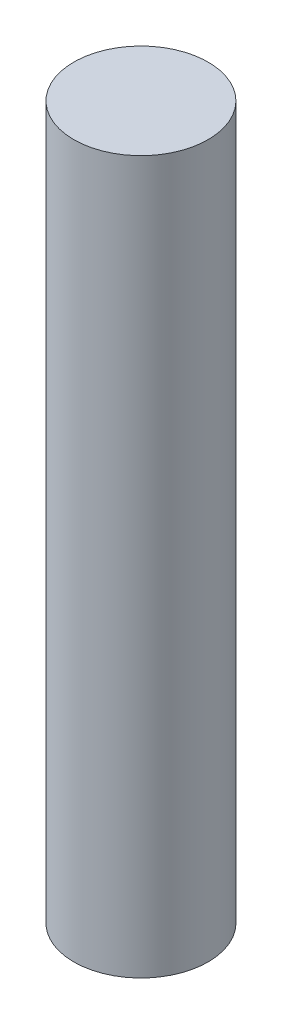
ISO-10303-21;
HEADER;
FILE_DESCRIPTION(('STEP AP214'),'2;1');
FILE_NAME('part.step','',(''),(''),'','','');
FILE_SCHEMA(('AUTOMOTIVE_DESIGN { 1 0 10303 214 1 1 1 1 }'));
ENDSEC;
DATA;
#1=APPLICATION_CONTEXT('core data for automotive mechanical design processes');
#2=APPLICATION_PROTOCOL_DEFINITION('international standard','automotive_design',2000,#1);
#3=PRODUCT_CONTEXT('',#1,'mechanical');
#4=PRODUCT('Part','Part','',(#3));
#5=PRODUCT_RELATED_PRODUCT_CATEGORY('part','',(#4));
#6=PRODUCT_DEFINITION_FORMATION('','',#4);
#7=PRODUCT_DEFINITION_CONTEXT('part definition',#1,'design');
#8=PRODUCT_DEFINITION('design','',#6,#7);
#9=PRODUCT_DEFINITION_SHAPE('','',#8);
#10=(LENGTH_UNIT() NAMED_UNIT(*) SI_UNIT(.MILLI.,.METRE.));
#11=(NAMED_UNIT(*) PLANE_ANGLE_UNIT() SI_UNIT($,.RADIAN.));
#12=(NAMED_UNIT(*) SI_UNIT($,.STERADIAN.) SOLID_ANGLE_UNIT());
#13=UNCERTAINTY_MEASURE_WITH_UNIT(LENGTH_MEASURE(1.E-05),#10,'distance_accuracy_value','');
#14=(GEOMETRIC_REPRESENTATION_CONTEXT(3) GLOBAL_UNCERTAINTY_ASSIGNED_CONTEXT((#13)) GLOBAL_UNIT_ASSIGNED_CONTEXT((#10,
#11,#12)) REPRESENTATION_CONTEXT('',''));
#15=CARTESIAN_POINT('',(0.,0.,0.));
#16=DIRECTION('',(0.,0.,1.));
#17=DIRECTION('',(1.,0.,0.));
#18=AXIS2_PLACEMENT_3D('',#15,#16,#17);
#19=CARTESIAN_POINT('',(0.,15.,0.));
#20=DIRECTION('',(0.,-1.,0.));
#21=DIRECTION('',(0.,0.,-1.));
#22=AXIS2_PLACEMENT_3D('',#19,#20,#21);
#23=CYLINDRICAL_SURFACE('',#22,1.415);
#24=CARTESIAN_POINT('',(0.,15.,0.));
#25=DIRECTION('',(0.,1.,0.));
#26=DIRECTION('',(0.,0.,1.));
#27=AXIS2_PLACEMENT_3D('',#24,#25,#26);
#28=CIRCLE('',#27,1.415);
#29=CARTESIAN_POINT('',(0.,15.,1.415));
#30=VERTEX_POINT('',#29);
#31=EDGE_CURVE('E10',#30,#30,#28,.T.);
#32=ORIENTED_EDGE('',*,*,#31,.F.);
#33=EDGE_LOOP('',(#32));
#34=FACE_BOUND('',#33,.T.);
#35=CARTESIAN_POINT('',(0.,0.,0.));
#36=DIRECTION('',(0.,1.,0.));
#37=DIRECTION('',(0.,0.,1.));
#38=AXIS2_PLACEMENT_3D('',#35,#36,#37);
#39=CIRCLE('',#38,1.415);
#40=CARTESIAN_POINT('',(0.,0.,1.415));
#41=VERTEX_POINT('',#40);
#42=EDGE_CURVE('E46',#41,#41,#39,.T.);
#43=ORIENTED_EDGE('',*,*,#42,.T.);
#44=EDGE_LOOP('',(#43));
#45=FACE_BOUND('',#44,.T.);
#46=ADVANCED_FACE('F43',(#34,#45),#23,.T.);
#47=CARTESIAN_POINT('',(0.,15.,0.));
#48=DIRECTION('',(0.,1.,0.));
#49=DIRECTION('',(0.,0.,1.));
#50=AXIS2_PLACEMENT_3D('',#47,#48,#49);
#51=PLANE('',#50);
#52=ORIENTED_EDGE('',*,*,#31,.T.);
#53=EDGE_LOOP('',(#52));
#54=FACE_BOUND('',#53,.T.);
#55=ADVANCED_FACE('F60',(#54),#51,.T.);
#56=CARTESIAN_POINT('',(0.,0.,0.));
#57=DIRECTION('',(0.,1.,0.));
#58=DIRECTION('',(0.,0.,1.));
#59=AXIS2_PLACEMENT_3D('',#56,#57,#58);
#60=PLANE('',#59);
#61=ORIENTED_EDGE('',*,*,#42,.F.);
#62=EDGE_LOOP('',(#61));
#63=FACE_BOUND('',#62,.T.);
#64=ADVANCED_FACE('F58',(#63),#60,.F.);
#65=CLOSED_SHELL('',(#46,#55,#64));
#66=MANIFOLD_SOLID_BREP('B2',#65);
#67=ADVANCED_BREP_SHAPE_REPRESENTATION('',(#18,#66),#14);
#68=SHAPE_DEFINITION_REPRESENTATION(#9,#67);
ENDSEC;
END-ISO-10303-21;
